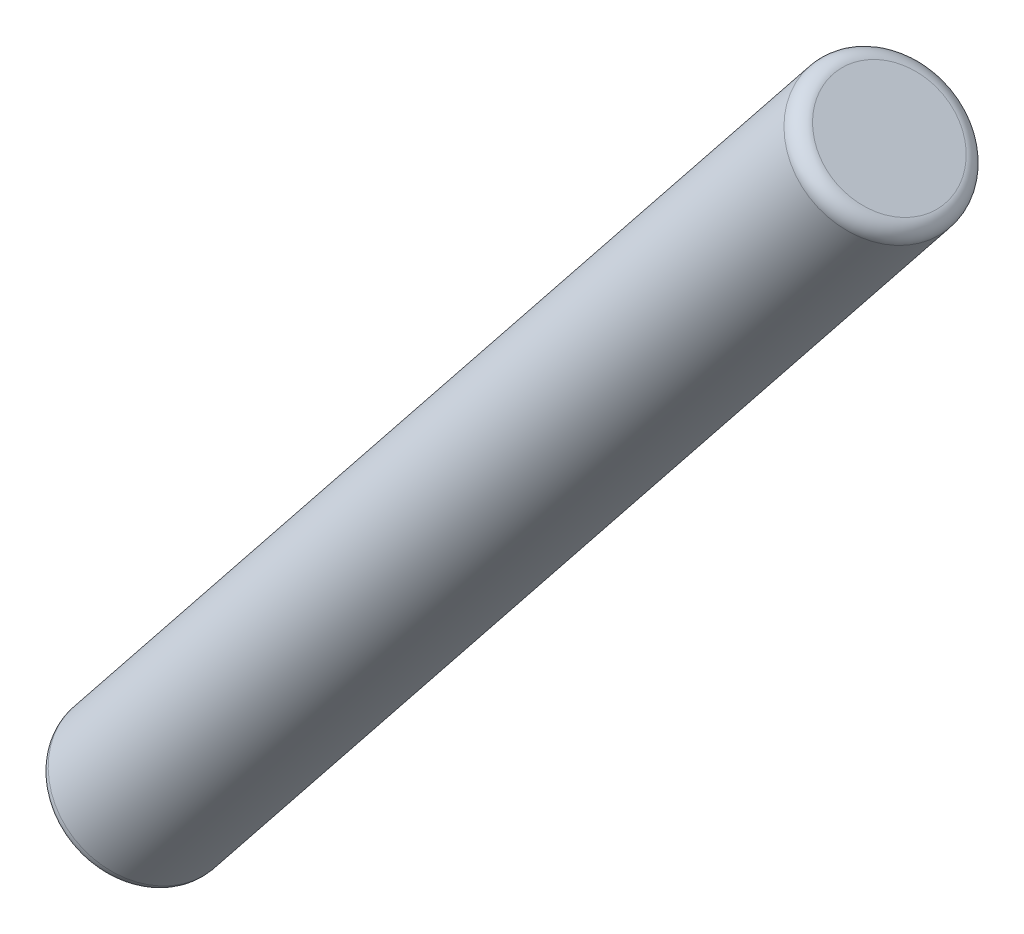
ISO-10303-21;
HEADER;
FILE_DESCRIPTION(('STEP AP214'),'2;1');
FILE_NAME('part.step','',(''),(''),'','','');
FILE_SCHEMA(('AUTOMOTIVE_DESIGN { 1 0 10303 214 1 1 1 1 }'));
ENDSEC;
DATA;
#1=APPLICATION_CONTEXT('core data for automotive mechanical design processes');
#2=APPLICATION_PROTOCOL_DEFINITION('international standard','automotive_design',2000,#1);
#3=PRODUCT_CONTEXT('',#1,'mechanical');
#4=PRODUCT('Part','Part','',(#3));
#5=PRODUCT_RELATED_PRODUCT_CATEGORY('part','',(#4));
#6=PRODUCT_DEFINITION_FORMATION('','',#4);
#7=PRODUCT_DEFINITION_CONTEXT('part definition',#1,'design');
#8=PRODUCT_DEFINITION('design','',#6,#7);
#9=PRODUCT_DEFINITION_SHAPE('','',#8);
#10=(LENGTH_UNIT() NAMED_UNIT(*) SI_UNIT(.MILLI.,.METRE.));
#11=(NAMED_UNIT(*) PLANE_ANGLE_UNIT() SI_UNIT($,.RADIAN.));
#12=(NAMED_UNIT(*) SI_UNIT($,.STERADIAN.) SOLID_ANGLE_UNIT());
#13=UNCERTAINTY_MEASURE_WITH_UNIT(LENGTH_MEASURE(1.E-05),#10,'distance_accuracy_value','');
#14=(GEOMETRIC_REPRESENTATION_CONTEXT(3) GLOBAL_UNCERTAINTY_ASSIGNED_CONTEXT((#13)) GLOBAL_UNIT_ASSIGNED_CONTEXT((#10,
#11,#12)) REPRESENTATION_CONTEXT('',''));
#15=CARTESIAN_POINT('',(0.,0.,0.));
#16=DIRECTION('',(0.,0.,1.));
#17=DIRECTION('',(1.,0.,0.));
#18=AXIS2_PLACEMENT_3D('',#15,#16,#17);
#19=CARTESIAN_POINT('',(-12.5290575606454,22.7820700692899,0.));
#20=DIRECTION('',(-0.623489801858733,-0.78183148246803,0.));
#21=DIRECTION('',(0.78183148246803,-0.623489801858733,0.));
#22=AXIS2_PLACEMENT_3D('',#19,#20,#21);
#23=PLANE('',#22);
#24=CARTESIAN_POINT('',(-12.5290575606454,22.7820700692899,0.));
#25=DIRECTION('',(0.623489801858734,0.78183148246803,0.));
#26=DIRECTION('',(-0.78183148246803,0.623489801858734,0.));
#27=AXIS2_PLACEMENT_3D('',#24,#25,#26);
#28=CIRCLE('',#27,1.);
#29=CARTESIAN_POINT('',(-12.7178880096153,22.9326573273541,-0.970395042882305));
#30=VERTEX_POINT('',#29);
#31=CARTESIAN_POINT('',(-12.3402271116755,22.6314828112257,0.970395042882289));
#32=VERTEX_POINT('',#31);
#33=EDGE_CURVE('E21',#30,#32,#28,.F.);
#34=ORIENTED_EDGE('',*,*,#33,.F.);
#35=CARTESIAN_POINT('',(-12.3402271116755,22.6314828112257,0.970395042882289));
#36=CARTESIAN_POINT('',(-12.3544144080542,22.6427968025479,0.974912098495441));
#37=CARTESIAN_POINT('',(-12.3687009280373,22.6541899220542,0.978919008062197));
#38=CARTESIAN_POINT('',(-12.3974270845817,22.6770982674632,0.985902484640712));
#39=CARTESIAN_POINT('',(-12.4118667211429,22.6886134933659,0.988879051652471));
#40=CARTESIAN_POINT('',(-12.4408537802129,22.7117299015962,0.993791792658787));
#41=CARTESIAN_POINT('',(-12.4554012027216,22.7233310839237,0.995727966653344));
#42=CARTESIAN_POINT('',(-12.4845580348339,22.7465828816374,0.998554013272497));
#43=CARTESIAN_POINT('',(-12.4991674444375,22.7582334970235,0.999443885897093));
#44=CARTESIAN_POINT('',(-12.5284022914415,22.7815475095372,1.00017448072121));
#45=CARTESIAN_POINT('',(-12.5430277288418,22.7932109066648,1.00001520292074));
#46=CARTESIAN_POINT('',(-12.5722486124438,22.816513783737,0.998648011221111));
#47=CARTESIAN_POINT('',(-12.5868440586454,22.8281532636817,0.997440097321963));
#48=CARTESIAN_POINT('',(-12.6159590377012,22.8513716846965,0.993979430437565));
#49=CARTESIAN_POINT('',(-12.6304785705553,22.8629506257666,0.991726677452317));
#50=CARTESIAN_POINT('',(-12.6593960389533,22.8860115372879,0.986183421336295));
#51=CARTESIAN_POINT('',(-12.6737939744973,22.8974935077391,0.982892918205523));
#52=CARTESIAN_POINT('',(-12.7024229470807,22.9203243515254,0.975284514685127));
#53=CARTESIAN_POINT('',(-12.7166539841202,22.9316732248606,0.970966614295503));
#54=CARTESIAN_POINT('',(-12.7449043835771,22.9542021666528,0.961317002037436));
#55=CARTESIAN_POINT('',(-12.7589237459945,22.9653822351098,0.955985290168993));
#56=CARTESIAN_POINT('',(-12.7867066861092,22.9875383905162,0.944324830473166));
#57=CARTESIAN_POINT('',(-12.8004702638065,22.9985144774655,0.937996082645781));
#58=CARTESIAN_POINT('',(-12.8276983291726,23.0202281350258,0.924361463619028));
#59=CARTESIAN_POINT('',(-12.8411628168415,23.0309657056367,0.917055592419659));
#60=CARTESIAN_POINT('',(-12.8677503378916,23.0521685461504,0.901489713621321));
#61=CARTESIAN_POINT('',(-12.8808733712727,23.0626338160533,0.893229706022352));
#62=CARTESIAN_POINT('',(-12.9067366938291,23.0832591275401,0.87578154346503));
#63=CARTESIAN_POINT('',(-12.9194769830043,23.093419169124,0.866593388506678));
#64=CARTESIAN_POINT('',(-12.9445347314858,23.1134020567233,0.847317840565093));
#65=CARTESIAN_POINT('',(-12.956852190792,23.1232249027386,0.837230447581859));
#66=CARTESIAN_POINT('',(-12.9810255242512,23.1425024928929,0.816188162261558));
#67=CARTESIAN_POINT('',(-12.9928813984043,23.1519572370319,0.80523326992449));
#68=CARTESIAN_POINT('',(-13.0160942585912,23.1704688753109,0.782490454038036));
#69=CARTESIAN_POINT('',(-13.0274512446252,23.1795257694509,0.770702530488648));
#70=CARTESIAN_POINT('',(-13.0496305952928,23.197213211391,0.746330741356198));
#71=CARTESIAN_POINT('',(-13.0604529599266,23.2058437591912,0.733746875773135));
#72=CARTESIAN_POINT('',(-13.0815290166357,23.2226513535593,0.707822796032554));
#73=CARTESIAN_POINT('',(-13.0917827087112,23.2308284001273,0.694482581875038));
#74=CARTESIAN_POINT('',(-13.1116891583767,23.2467032640027,0.667087778374582));
#75=CARTESIAN_POINT('',(-13.1213419159667,23.2544010813101,0.653033189031644));
#76=CARTESIAN_POINT('',(-13.1400161255831,23.2692932665376,0.624253855576046));
#77=CARTESIAN_POINT('',(-13.1490375776095,23.2764876344576,0.609529111463385));
#78=CARTESIAN_POINT('',(-13.1664207910183,23.2903502845645,0.579455799909345));
#79=CARTESIAN_POINT('',(-13.1747825524008,23.2970185667512,0.564107232467966));
#80=CARTESIAN_POINT('',(-13.1908200762766,23.3098080652657,0.532834559256576));
#81=CARTESIAN_POINT('',(-13.1984958387699,23.3159292815934,0.516910453486566));
#82=CARTESIAN_POINT('',(-13.2131372105351,23.3276053859529,0.484536833883647));
#83=CARTESIAN_POINT('',(-13.2201028198069,23.3331602739846,0.468087320050738));
#84=CARTESIAN_POINT('',(-13.2333019819706,23.3436862545656,0.434714539299268));
#85=CARTESIAN_POINT('',(-13.2395355348625,23.3486573471149,0.417791272380706));
#86=CARTESIAN_POINT('',(-13.2512509218454,23.3580000564747,0.383524610295059));
#87=CARTESIAN_POINT('',(-13.2567327559364,23.3623716732851,0.366181215127973));
#88=CARTESIAN_POINT('',(-13.2669276416433,23.3705018233374,0.331127454648329));
#89=CARTESIAN_POINT('',(-13.271640693259,23.3742603565793,0.313417089335772));
#90=CARTESIAN_POINT('',(-13.2781222589775,23.3794292327625,0.286621176197651));
#91=CARTESIAN_POINT('',(-13.2801848658951,23.3810741068937,0.2776503641818));
#92=CARTESIAN_POINT('',(-13.2841121773434,23.3842060332551,0.259637933316435));
#93=CARTESIAN_POINT('',(-13.2859768818741,23.3856930854853,0.250596314466923));
#94=CARTESIAN_POINT('',(-13.2899441050657,23.388856840443,0.230214927382435));
#95=CARTESIAN_POINT('',(-13.2919920421085,23.3904900157972,0.218857734968917));
#96=CARTESIAN_POINT('',(-13.2957817200384,23.3935121824796,0.196060131715919));
#97=CARTESIAN_POINT('',(-13.297523460057,23.3949011731152,0.18461972064047));
#98=CARTESIAN_POINT('',(-13.3006980180394,23.3974327937094,0.161668726265683));
#99=CARTESIAN_POINT('',(-13.3021308291787,23.3985754182257,0.150158141421912));
#100=CARTESIAN_POINT('',(-13.3046860110148,23.4006130912539,0.127080168952516));
#101=CARTESIAN_POINT('',(-13.3058083688759,23.4015081295293,0.115512778998395));
#102=CARTESIAN_POINT('',(-13.307494393863,23.4028526551652,0.0952966701998477));
#103=CARTESIAN_POINT('',(-13.3081275386767,23.4033575524674,0.086657351629304));
#104=CARTESIAN_POINT('',(-13.3092203300536,23.4042289763082,0.0693605777382208));
#105=CARTESIAN_POINT('',(-13.3096799669394,23.4045954951286,0.0607031214331175));
#106=CARTESIAN_POINT('',(-13.310800297713,23.4054888129511,0.0347101927620318));
#107=CARTESIAN_POINT('',(-13.311202378796,23.4058093470604,0.0173545565436716));
#108=CARTESIAN_POINT('',(-13.3112665806426,23.405860352862,-0.00595764711131382));
#109=CARTESIAN_POINT('',(-13.3112412360164,23.4058400883187,-0.0119151669850325));
#110=CARTESIAN_POINT('',(-13.3111016617685,23.4057286905566,-0.0238287070720348));
#111=CARTESIAN_POINT('',(-13.3109874308606,23.4056375563123,-0.0297847272623686));
#112=CARTESIAN_POINT('',(-13.3105203416816,23.4052649741326,-0.0473880368927915));
#113=CARTESIAN_POINT('',(-13.3100437467374,23.4048848702997,-0.0590303134681221));
#114=CARTESIAN_POINT('',(-13.3087550508903,23.4038571758727,-0.0822834048270624));
#115=CARTESIAN_POINT('',(-13.3079429726021,23.4032096033084,-0.0938942216782521));
#116=CARTESIAN_POINT('',(-13.3059855292445,23.4016487277896,-0.117068345623982));
#117=CARTESIAN_POINT('',(-13.3048402077607,23.4007354595861,-0.128631658731172));
#118=CARTESIAN_POINT('',(-13.3022152436129,23.3986423315489,-0.151693806700045));
#119=CARTESIAN_POINT('',(-13.300735665875,23.3974625234882,-0.163192653639729));
#120=CARTESIAN_POINT('',(-13.2981880758727,23.3954310412934,-0.180987745544213));
#121=CARTESIAN_POINT('',(-13.297232004429,23.3946686489653,-0.187310433087937));
#122=CARTESIAN_POINT('',(-13.2952072744729,23.3930540491148,-0.199924931408696));
#123=CARTESIAN_POINT('',(-13.2941386341884,23.3922018561338,-0.206216747012584));
#124=CARTESIAN_POINT('',(-13.2912934464658,23.3899329185245,-0.222539972219412));
#125=CARTESIAN_POINT('',(-13.2894754154448,23.3884830763048,-0.232559706670035));
#126=CARTESIAN_POINT('',(-13.2856581914919,23.3854389344668,-0.252197192201128));
#127=CARTESIAN_POINT('',(-13.2836668218501,23.3838508732568,-0.261817411688062));
#128=CARTESIAN_POINT('',(-13.2787898016028,23.3799615769863,-0.284066739922906));
#129=CARTESIAN_POINT('',(-13.2758227249245,23.3775954037151,-0.296666762115975));
#130=CARTESIAN_POINT('',(-13.2701044578544,23.3730352132486,-0.319320108463836));
#131=CARTESIAN_POINT('',(-13.2674199351031,23.3708943634627,-0.3294010296881));
#132=CARTESIAN_POINT('',(-13.2622742112952,23.3667907545259,-0.34775432920854));
#133=CARTESIAN_POINT('',(-13.2598518762548,23.3648589908155,-0.356044582591604));
#134=CARTESIAN_POINT('',(-13.2538558041796,23.3600772426666,-0.375756864460449));
#135=CARTESIAN_POINT('',(-13.250201525063,23.3571630272633,-0.387139032566291));
#136=CARTESIAN_POINT('',(-13.2427212314131,23.3511976532262,-0.409243197246837));
#137=CARTESIAN_POINT('',(-13.2389089375951,23.3481574360705,-0.41997280459966));
#138=CARTESIAN_POINT('',(-13.2309887693594,23.3418412865028,-0.441252389787236));
#139=CARTESIAN_POINT('',(-13.2268808878339,23.3385653484224,-0.451802363294902));
#140=CARTESIAN_POINT('',(-13.2183734802972,23.3317808994835,-0.472708323481616));
#141=CARTESIAN_POINT('',(-13.2139739503496,23.3282723854856,-0.483064307539872));
#142=CARTESIAN_POINT('',(-13.2048892031721,23.3210275353673,-0.503569308417752));
#143=CARTESIAN_POINT('',(-13.2002039851006,23.3172911985756,-0.513718324627415));
#144=CARTESIAN_POINT('',(-13.1913298388215,23.3102143085423,-0.53218158539158));
#145=CARTESIAN_POINT('',(-13.1871822822655,23.3069067471942,-0.540528397830645));
#146=CARTESIAN_POINT('',(-13.1786941335027,23.3001376875703,-0.557059339183089));
#147=CARTESIAN_POINT('',(-13.1743535439633,23.2966761914217,-0.565243470342307));
#148=CARTESIAN_POINT('',(-13.161047678659,23.286065148636,-0.589540330255142));
#149=CARTESIAN_POINT('',(-13.1517971107239,23.2786880942931,-0.605400012760428));
#150=CARTESIAN_POINT('',(-13.1338028047779,23.2643381693183,-0.634403301264411));
#151=CARTESIAN_POINT('',(-13.1251453892381,23.2574341380695,-0.647634982934644));
#152=CARTESIAN_POINT('',(-13.1072978099989,23.2432012221585,-0.673497145025998));
#153=CARTESIAN_POINT('',(-13.0981076919737,23.2358723739204,-0.686127676821314));
#154=CARTESIAN_POINT('',(-13.0865064630537,23.2266207175191,-0.701288551346647));
#155=CARTESIAN_POINT('',(-13.084323504925,23.2248798685463,-0.70410845333264));
#156=CARTESIAN_POINT('',(-13.0784730823596,23.2202143163272,-0.711580927042978));
#157=CARTESIAN_POINT('',(-13.07478359979,23.217272053304,-0.716205436422623));
#158=CARTESIAN_POINT('',(-13.0665117755807,23.2106754958486,-0.726370794898571));
#159=CARTESIAN_POINT('',(-13.0619121143729,23.2070073894527,-0.731888588610669));
#160=CARTESIAN_POINT('',(-13.0514141495552,23.1986355436626,-0.744181869237192));
#161=CARTESIAN_POINT('',(-13.0454860948313,23.1939080784175,-0.750915846833863));
#162=CARTESIAN_POINT('',(-13.0322441374013,23.1833479709242,-0.765504344778944));
#163=CARTESIAN_POINT('',(-13.0248948031761,23.1774870729315,-0.773306302522898));
#164=CARTESIAN_POINT('',(-13.0087112416875,23.1645811141224,-0.78985657068398));
#165=CARTESIAN_POINT('',(-12.9998367853875,23.1575039716823,-0.79854060941768));
#166=CARTESIAN_POINT('',(-12.9804966626172,23.1420807389395,-0.816639500997307));
#167=CARTESIAN_POINT('',(-12.9699870028506,23.1336995651335,-0.825977473140544));
#168=CARTESIAN_POINT('',(-12.9472673848856,23.1155812746956,-0.845124777400396));
#169=CARTESIAN_POINT('',(-12.93501074895,23.1058069337981,-0.854843851350603));
#170=CARTESIAN_POINT('',(-12.9158008923035,23.0904875844276,-0.869152113437224));
#171=CARTESIAN_POINT('',(-12.9089882903442,23.0850547156864,-0.874052980499469));
#172=CARTESIAN_POINT('',(-12.8948947722018,23.0738155100626,-0.883838931627169));
#173=CARTESIAN_POINT('',(-12.8876078945073,23.0680044190327,-0.888710009803718));
#174=CARTESIAN_POINT('',(-12.8725555034321,23.0560005377429,-0.898388766740925));
#175=CARTESIAN_POINT('',(-12.8647841074004,23.049803056225,-0.903181473087578));
#176=CARTESIAN_POINT('',(-12.8487535078607,23.0370190797027,-0.912652886789043));
#177=CARTESIAN_POINT('',(-12.8404885434755,23.0304279905517,-0.917315651288564));
#178=CARTESIAN_POINT('',(-12.8234635541999,23.0168510146678,-0.926473215106189));
#179=CARTESIAN_POINT('',(-12.8146979599349,23.0098606865067,-0.93095108070295));
#180=CARTESIAN_POINT('',(-12.7966666063575,22.9954811618671,-0.939681671124749));
#181=CARTESIAN_POINT('',(-12.7873955367867,22.9880877305989,-0.943916461201294));
#182=CARTESIAN_POINT('',(-12.7683506676798,22.9728999542926,-0.95210048574873));
#183=CARTESIAN_POINT('',(-12.7585718895842,22.9651016389857,-0.956030774728017));
#184=CARTESIAN_POINT('',(-12.7385120173746,22.9491044247143,-0.963542534036146));
#185=CARTESIAN_POINT('',(-12.7282263548712,22.9409018825807,-0.967104055420413));
#186=CARTESIAN_POINT('',(-12.7178880096153,22.9326573273541,-0.970395042882305));
#187=B_SPLINE_CURVE_WITH_KNOTS('',3,(#35,#36,#37,#38,#39,#40,#41,#42,#43,#44,#45,#46,#47,#48,
#49,#50,#51,#52,#53,#54,#55,#56,#57,#58,#59,#60,#61,#62,#63,#64,#65,#66,#67,#68,#69,#70,#71,#72,
#73,#74,#75,#76,#77,#78,#79,#80,#81,#82,#83,#84,#85,#86,#87,#88,#89,#90,#91,#92,#93,#94,#95,#96,
#97,#98,#99,#100,#101,#102,#103,#104,#105,#106,#107,#108,#109,#110,#111,#112,#113,#114,#115,
#116,#117,#118,#119,#120,#121,#122,#123,#124,#125,#126,#127,#128,#129,#130,#131,#132,#133,#134,
#135,#136,#137,#138,#139,#140,#141,#142,#143,#144,#145,#146,#147,#148,#149,#150,#151,#152,#153,
#154,#155,#156,#157,#158,#159,#160,#161,#162,#163,#164,#165,#166,#167,#168,#169,#170,#171,#172,
#173,#174,#175,#176,#177,#178,#179,#180,#181,#182,#183,#184,#185,#186),.UNSPECIFIED.,.F.,.F.,(4,
2,2,2,2,2,2,2,2,2,2,2,2,2,2,2,2,2,2,2,2,2,2,2,2,2,2,2,2,2,2,2,2,2,2,2,2,2,2,2,2,2,2,2,2,2,2,2,2,
2,2,2,2,2,2,2,2,2,2,2,2,2,2,2,2,2,2,2,2,2,2,2,2,2,2,4),(0.,0.0560925125517376,0.112185025103476,
0.168277537655213,0.224370050206951,0.28046256275869,0.336555075310429,0.392647587862167,
0.448740100413906,0.504832612965643,0.560925125517381,0.617017638069119,0.673110150620858,
0.729202663172595,0.785295175724334,0.841387688276072,0.897480200827809,0.953572713379546,
1.00966522593129,1.06575773848302,1.12185025103476,1.1779427635865,1.23403527613824,
1.29012778868998,1.34622030124171,1.40231281379345,1.45840532634519,1.51449783889693,
1.54254685374406,1.57059586859118,1.60555481341476,1.64051385740345,1.67547367359228,
1.71043493498173,1.7364636100422,1.76249373664311,1.81455518297512,1.83242736107253,
1.85029979780409,1.88526595146291,1.92022974846929,1.95518897455393,1.99014141597334,
2.00945947119555,2.0287744030908,2.05962931714348,2.08947987680573,2.12894686785742,
2.16089030609387,2.1874383524437,2.22434256556311,2.25969205131315,2.29504238737371,
2.3303932006725,2.3657441181397,2.39540952145582,2.42507451495212,2.48439575665334,
2.53613551088943,2.5878708354837,2.5997758034352,2.61959606364065,2.64379133688114,
2.6742092639879,2.71084946229671,2.7537115106722,2.80279494958934,2.85809928117069,
2.88808747466361,2.9196312391153,2.95273055876602,2.98738541828431,3.02359580276706,
3.06136169773958,3.10068308915567,3.14155996339763),.UNSPECIFIED.);
#188=EDGE_CURVE('E44',#32,#30,#187,.T.);
#189=ORIENTED_EDGE('',*,*,#188,.F.);
#190=EDGE_LOOP('',(#34,#189));
#191=FACE_BOUND('',#190,.T.);
#192=ADVANCED_FACE('F17',(#191),#23,.F.);
#193=CARTESIAN_POINT('',(-24.99885359782,7.1454404199293,0.));
#194=DIRECTION('',(-0.623489801858733,-0.78183148246803,0.));
#195=DIRECTION('',(0.78183148246803,-0.623489801858733,0.));
#196=AXIS2_PLACEMENT_3D('',#193,#194,#195);
#197=PLANE('',#196);
#198=CARTESIAN_POINT('',(-24.99885359782,7.14544041992928,0.));
#199=DIRECTION('',(-0.623489801858734,-0.78183148246803,0.));
#200=DIRECTION('',(0.78183148246803,-0.623489801858734,0.));
#201=AXIS2_PLACEMENT_3D('',#198,#199,#200);
#202=CIRCLE('',#201,0.999999999999999);
#203=CARTESIAN_POINT('',(-25.1876840467899,7.2960276779935,-0.970395042882296));
#204=VERTEX_POINT('',#203);
#205=CARTESIAN_POINT('',(-24.8100231488501,6.99485316186509,0.9703950428823));
#206=VERTEX_POINT('',#205);
#207=EDGE_CURVE('E46',#204,#206,#202,.F.);
#208=ORIENTED_EDGE('',*,*,#207,.F.);
#209=CARTESIAN_POINT('',(-25.1876840467899,7.2960276779935,-0.970395042882293));
#210=CARTESIAN_POINT('',(-25.0795651526305,7.20980573706596,-1.00481408205658));
#211=CARTESIAN_POINT('',(-24.9676989182434,7.12059539202774,-0.999205739839919));
#212=CARTESIAN_POINT('',(-24.8261187287483,7.00768895851247,-0.992107707460989));
#213=CARTESIAN_POINT('',(-24.6947067200222,6.90289137857383,-0.921229960033514));
#214=CARTESIAN_POINT('',(-24.5349808807498,6.77551427223719,-0.835081001476856));
#215=CARTESIAN_POINT('',(-24.4182866959033,6.68245376518476,-0.669765205073548));
#216=CARTESIAN_POINT('',(-24.2875747313581,6.57821445185143,-0.484591003405751));
#217=CARTESIAN_POINT('',(-24.2401682028637,6.54040900691792,-0.241523209546131));
#218=CARTESIAN_POINT('',(-24.1929572172609,6.50275950223676,0.000541976007206036));
#219=CARTESIAN_POINT('',(-24.2405639204022,6.54072458112433,0.24354777646273));
#220=CARTESIAN_POINT('',(-24.2826975075449,6.5743249956488,0.458616357021549));
#221=CARTESIAN_POINT('',(-24.3925780016703,6.6619517656711,0.63140210857816));
#222=CARTESIAN_POINT('',(-24.4819815919463,6.73324874978676,0.771988175838274));
#223=CARTESIAN_POINT('',(-24.6051444562212,6.83146785654447,0.86395274249409));
#224=CARTESIAN_POINT('',(-24.7013757537097,6.90820975546922,0.935807758406298));
#225=CARTESIAN_POINT('',(-24.8100231488501,6.99485316186509,0.9703950428823));
#226=B_SPLINE_CURVE_WITH_KNOTS('',2,(#209,#210,#211,#212,#213,#214,#215,#216,#217,#218,#219,
#220,#221,#222,#223,#224,#225),.UNSPECIFIED.,.F.,.F.,(3,2,2,2,2,2,2,2,3),(0.,0.125,0.25,0.375,
0.5,0.625,0.75,0.875,1.),.UNSPECIFIED.);
#227=EDGE_CURVE('E35',#204,#206,#226,.T.);
#228=ORIENTED_EDGE('',*,*,#227,.T.);
#229=EDGE_LOOP('',(#208,#228));
#230=FACE_BOUND('',#229,.T.);
#231=ADVANCED_FACE('F53',(#230),#197,.T.);
#232=CARTESIAN_POINT('',(-12.6849300111101,22.5866121986729,0.));
#233=DIRECTION('',(0.623489801858731,0.781831482468032,0.));
#234=DIRECTION('',(-0.781831482468032,0.623489801858731,0.));
#235=AXIS2_PLACEMENT_3D('',#232,#233,#234);
#236=TOROIDAL_SURFACE('',#235,1.,0.250000000000001);
#237=CARTESIAN_POINT('',(-12.6849300111101,22.5866121986729,0.));
#238=DIRECTION('',(-0.623489801858733,-0.78183148246803,0.));
#239=DIRECTION('',(0.78183148246803,-0.623489801858733,0.));
#240=AXIS2_PLACEMENT_3D('',#237,#238,#239);
#241=CIRCLE('',#240,1.25);
#242=CARTESIAN_POINT('',(-11.707640658025,21.8072499463495,0.));
#243=VERTEX_POINT('',#242);
#244=EDGE_CURVE('E27',#243,#243,#241,.T.);
#245=ORIENTED_EDGE('',*,*,#244,.F.);
#246=EDGE_LOOP('',(#245));
#247=FACE_BOUND('',#246,.T.);
#248=ORIENTED_EDGE('',*,*,#188,.T.);
#249=ORIENTED_EDGE('',*,*,#33,.T.);
#250=EDGE_LOOP('',(#248,#249));
#251=FACE_BOUND('',#250,.T.);
#252=ADVANCED_FACE('F48',(#247,#251),#236,.T.);
#253=CARTESIAN_POINT('',(-24.8429811473554,7.3408982905463,0.));
#254=DIRECTION('',(-0.623489801858734,-0.78183148246803,0.));
#255=DIRECTION('',(0.78183148246803,-0.623489801858734,0.));
#256=AXIS2_PLACEMENT_3D('',#253,#254,#255);
#257=TOROIDAL_SURFACE('',#256,0.999999999999988,0.250000000000008);
#258=ORIENTED_EDGE('',*,*,#207,.T.);
#259=ORIENTED_EDGE('',*,*,#227,.F.);
#260=EDGE_LOOP('',(#258,#259));
#261=FACE_BOUND('',#260,.T.);
#262=CARTESIAN_POINT('',(-24.8429811473554,7.34089829054631,0.));
#263=DIRECTION('',(-0.623489801858733,-0.78183148246803,0.));
#264=DIRECTION('',(0.78183148246803,-0.623489801858733,0.));
#265=AXIS2_PLACEMENT_3D('',#262,#263,#264);
#266=CIRCLE('',#265,1.25);
#267=CARTESIAN_POINT('',(-23.8656917942703,6.56153603822289,0.));
#268=VERTEX_POINT('',#267);
#269=EDGE_CURVE('E11',#268,#268,#266,.F.);
#270=ORIENTED_EDGE('',*,*,#269,.F.);
#271=EDGE_LOOP('',(#270));
#272=FACE_BOUND('',#271,.T.);
#273=ADVANCED_FACE('F19',(#261,#272),#257,.T.);
#274=CARTESIAN_POINT('',(-18.7639555792327,14.9637552446096,0.));
#275=DIRECTION('',(-0.623489801858733,-0.78183148246803,0.));
#276=DIRECTION('',(0.78183148246803,-0.623489801858733,0.));
#277=AXIS2_PLACEMENT_3D('',#274,#275,#276);
#278=CYLINDRICAL_SURFACE('',#277,1.25);
#279=ORIENTED_EDGE('',*,*,#244,.T.);
#280=EDGE_LOOP('',(#279));
#281=FACE_BOUND('',#280,.T.);
#282=ORIENTED_EDGE('',*,*,#269,.T.);
#283=EDGE_LOOP('',(#282));
#284=FACE_BOUND('',#283,.T.);
#285=ADVANCED_FACE('F63',(#281,#284),#278,.T.);
#286=CLOSED_SHELL('',(#192,#231,#252,#273,#285));
#287=MANIFOLD_SOLID_BREP('B1',#286);
#288=ADVANCED_BREP_SHAPE_REPRESENTATION('',(#18,#287),#14);
#289=SHAPE_DEFINITION_REPRESENTATION(#9,#288);
ENDSEC;
END-ISO-10303-21;
